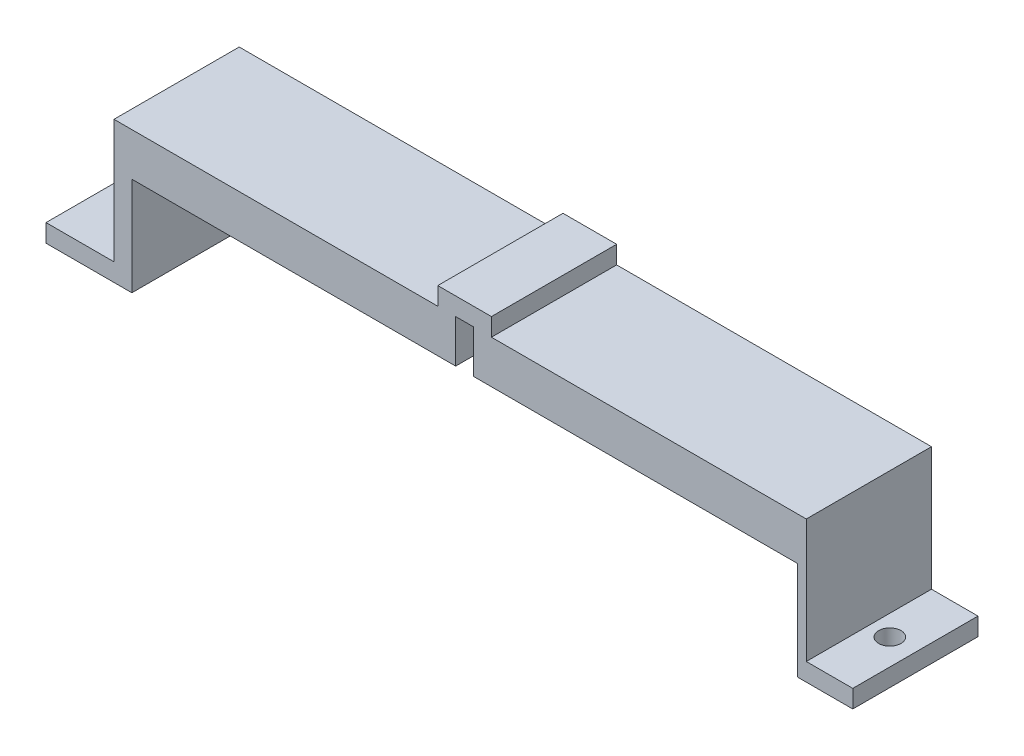
ISO-10303-21;
HEADER;
FILE_DESCRIPTION(('STEP AP214'),'2;1');
FILE_NAME('part.step','',(''),(''),'','','');
FILE_SCHEMA(('AUTOMOTIVE_DESIGN { 1 0 10303 214 1 1 1 1 }'));
ENDSEC;
DATA;
#1=APPLICATION_CONTEXT('core data for automotive mechanical design processes');
#2=APPLICATION_PROTOCOL_DEFINITION('international standard','automotive_design',2000,#1);
#3=PRODUCT_CONTEXT('',#1,'mechanical');
#4=PRODUCT('Part','Part','',(#3));
#5=PRODUCT_RELATED_PRODUCT_CATEGORY('part','',(#4));
#6=PRODUCT_DEFINITION_FORMATION('','',#4);
#7=PRODUCT_DEFINITION_CONTEXT('part definition',#1,'design');
#8=PRODUCT_DEFINITION('design','',#6,#7);
#9=PRODUCT_DEFINITION_SHAPE('','',#8);
#10=(LENGTH_UNIT() NAMED_UNIT(*) SI_UNIT(.MILLI.,.METRE.));
#11=(NAMED_UNIT(*) PLANE_ANGLE_UNIT() SI_UNIT($,.RADIAN.));
#12=(NAMED_UNIT(*) SI_UNIT($,.STERADIAN.) SOLID_ANGLE_UNIT());
#13=UNCERTAINTY_MEASURE_WITH_UNIT(LENGTH_MEASURE(1.E-05),#10,'distance_accuracy_value','');
#14=(GEOMETRIC_REPRESENTATION_CONTEXT(3) GLOBAL_UNCERTAINTY_ASSIGNED_CONTEXT((#13)) GLOBAL_UNIT_ASSIGNED_CONTEXT((#10,
#11,#12)) REPRESENTATION_CONTEXT('',''));
#15=CARTESIAN_POINT('',(0.,0.,0.));
#16=DIRECTION('',(0.,0.,1.));
#17=DIRECTION('',(1.,0.,0.));
#18=AXIS2_PLACEMENT_3D('',#15,#16,#17);
#19=CARTESIAN_POINT('',(2.54000000000001,-8.63600000000001,17.78));
#20=DIRECTION('',(-1.,0.,0.));
#21=DIRECTION('',(0.,-1.,0.));
#22=AXIS2_PLACEMENT_3D('',#19,#20,#21);
#23=PLANE('',#22);
#24=DIRECTION('',(0.,1.,0.));
#25=VECTOR('',#24,1.);
#26=CARTESIAN_POINT('',(2.54000000000001,-8.63600000000001,0.));
#27=LINE('',#26,#25);
#28=CARTESIAN_POINT('',(2.54000000000001,-8.63600000000001,0.));
#29=VERTEX_POINT('',#28);
#30=CARTESIAN_POINT('',(2.54000000000001,-2.54,0.));
#31=VERTEX_POINT('',#30);
#32=EDGE_CURVE('E218',#29,#31,#27,.T.);
#33=ORIENTED_EDGE('',*,*,#32,.T.);
#34=DIRECTION('',(0.,0.,-1.));
#35=VECTOR('',#34,1.);
#36=CARTESIAN_POINT('',(2.54000000000001,-2.54,17.78));
#37=LINE('',#36,#35);
#38=CARTESIAN_POINT('',(2.54000000000001,-2.54,17.78));
#39=VERTEX_POINT('',#38);
#40=EDGE_CURVE('E11',#39,#31,#37,.T.);
#41=ORIENTED_EDGE('',*,*,#40,.F.);
#42=DIRECTION('',(0.,1.,0.));
#43=VECTOR('',#42,1.);
#44=CARTESIAN_POINT('',(2.54000000000001,-8.63600000000001,17.78));
#45=LINE('',#44,#43);
#46=CARTESIAN_POINT('',(2.54000000000001,-8.63600000000001,17.78));
#47=VERTEX_POINT('',#46);
#48=EDGE_CURVE('E276',#47,#39,#45,.T.);
#49=ORIENTED_EDGE('',*,*,#48,.F.);
#50=DIRECTION('',(0.,0.,-1.));
#51=VECTOR('',#50,1.);
#52=CARTESIAN_POINT('',(2.54000000000001,-8.63600000000001,17.78));
#53=LINE('',#52,#51);
#54=EDGE_CURVE('E214',#47,#29,#53,.T.);
#55=ORIENTED_EDGE('',*,*,#54,.T.);
#56=EDGE_LOOP('',(#33,#41,#49,#55));
#57=FACE_BOUND('',#56,.T.);
#58=ADVANCED_FACE('F44',(#57),#23,.F.);
#59=CARTESIAN_POINT('',(2.54000000000001,-2.54,17.78));
#60=DIRECTION('',(0.,1.,0.));
#61=DIRECTION('',(0.,0.,1.));
#62=AXIS2_PLACEMENT_3D('',#59,#60,#61);
#63=PLANE('',#62);
#64=DIRECTION('',(1.,0.,0.));
#65=VECTOR('',#64,1.);
#66=CARTESIAN_POINT('',(2.54000000000001,-2.54,0.));
#67=LINE('',#66,#65);
#68=CARTESIAN_POINT('',(5.08000000000001,-2.54,0.));
#69=VERTEX_POINT('',#68);
#70=EDGE_CURVE('E222',#31,#69,#67,.T.);
#71=ORIENTED_EDGE('',*,*,#70,.T.);
#72=DIRECTION('',(0.,0.,-1.));
#73=VECTOR('',#72,1.);
#74=CARTESIAN_POINT('',(5.08000000000001,-2.54,17.78));
#75=LINE('',#74,#73);
#76=CARTESIAN_POINT('',(5.08000000000001,-2.54,17.78));
#77=VERTEX_POINT('',#76);
#78=EDGE_CURVE('E54',#77,#69,#75,.T.);
#79=ORIENTED_EDGE('',*,*,#78,.F.);
#80=DIRECTION('',(1.,0.,0.));
#81=VECTOR('',#80,1.);
#82=CARTESIAN_POINT('',(2.54000000000001,-2.54,17.78));
#83=LINE('',#82,#81);
#84=EDGE_CURVE('E141',#39,#77,#83,.T.);
#85=ORIENTED_EDGE('',*,*,#84,.F.);
#86=ORIENTED_EDGE('',*,*,#40,.T.);
#87=EDGE_LOOP('',(#71,#79,#85,#86));
#88=FACE_BOUND('',#87,.T.);
#89=ADVANCED_FACE('F427',(#88),#63,.F.);
#90=CARTESIAN_POINT('',(5.08000000000001,-2.54,17.78));
#91=DIRECTION('',(1.,0.,0.));
#92=DIRECTION('',(0.,1.,0.));
#93=AXIS2_PLACEMENT_3D('',#90,#91,#92);
#94=PLANE('',#93);
#95=DIRECTION('',(0.,-1.,0.));
#96=VECTOR('',#95,1.);
#97=CARTESIAN_POINT('',(5.08000000000001,-2.54,0.));
#98=LINE('',#97,#96);
#99=CARTESIAN_POINT('',(5.08000000000001,-8.636,0.));
#100=VERTEX_POINT('',#99);
#101=EDGE_CURVE('E225',#69,#100,#98,.T.);
#102=ORIENTED_EDGE('',*,*,#101,.T.);
#103=DIRECTION('',(0.,0.,-1.));
#104=VECTOR('',#103,1.);
#105=CARTESIAN_POINT('',(5.08000000000001,-8.636,17.78));
#106=LINE('',#105,#104);
#107=CARTESIAN_POINT('',(5.08000000000001,-8.636,17.78));
#108=VERTEX_POINT('',#107);
#109=EDGE_CURVE('E335',#108,#100,#106,.T.);
#110=ORIENTED_EDGE('',*,*,#109,.F.);
#111=DIRECTION('',(0.,-1.,0.));
#112=VECTOR('',#111,1.);
#113=CARTESIAN_POINT('',(5.08000000000001,-2.54,17.78));
#114=LINE('',#113,#112);
#115=EDGE_CURVE('E346',#77,#108,#114,.T.);
#116=ORIENTED_EDGE('',*,*,#115,.F.);
#117=ORIENTED_EDGE('',*,*,#78,.T.);
#118=EDGE_LOOP('',(#102,#110,#116,#117));
#119=FACE_BOUND('',#118,.T.);
#120=ADVANCED_FACE('F344',(#119),#94,.F.);
#121=CARTESIAN_POINT('',(5.08000000000001,-8.636,17.78));
#122=DIRECTION('',(0.,1.,0.));
#123=DIRECTION('',(0.,0.,1.));
#124=AXIS2_PLACEMENT_3D('',#121,#122,#123);
#125=PLANE('',#124);
#126=DIRECTION('',(1.,0.,0.));
#127=VECTOR('',#126,1.);
#128=CARTESIAN_POINT('',(5.08000000000001,-8.636,0.));
#129=LINE('',#128,#127);
#130=CARTESIAN_POINT('',(51.054,-8.636,0.));
#131=VERTEX_POINT('',#130);
#132=EDGE_CURVE('E228',#100,#131,#129,.T.);
#133=ORIENTED_EDGE('',*,*,#132,.T.);
#134=DIRECTION('',(0.,0.,-1.));
#135=VECTOR('',#134,1.);
#136=CARTESIAN_POINT('',(51.054,-8.636,17.78));
#137=LINE('',#136,#135);
#138=CARTESIAN_POINT('',(51.054,-8.636,17.78));
#139=VERTEX_POINT('',#138);
#140=EDGE_CURVE('E331',#139,#131,#137,.T.);
#141=ORIENTED_EDGE('',*,*,#140,.F.);
#142=DIRECTION('',(1.,0.,0.));
#143=VECTOR('',#142,1.);
#144=CARTESIAN_POINT('',(5.08000000000001,-8.636,17.78));
#145=LINE('',#144,#143);
#146=EDGE_CURVE('E365',#108,#139,#145,.T.);
#147=ORIENTED_EDGE('',*,*,#146,.F.);
#148=ORIENTED_EDGE('',*,*,#109,.T.);
#149=EDGE_LOOP('',(#133,#141,#147,#148));
#150=FACE_BOUND('',#149,.T.);
#151=ADVANCED_FACE('F355',(#150),#125,.F.);
#152=CARTESIAN_POINT('',(51.054,-22.606,17.78));
#153=DIRECTION('',(1.,0.,0.));
#154=DIRECTION('',(0.,0.,-1.));
#155=AXIS2_PLACEMENT_3D('',#152,#153,#154);
#156=PLANE('',#155);
#157=DIRECTION('',(0.,-1.,0.));
#158=VECTOR('',#157,1.);
#159=CARTESIAN_POINT('',(51.054,-22.606,0.));
#160=LINE('',#159,#158);
#161=CARTESIAN_POINT('',(51.054,-22.606,0.));
#162=VERTEX_POINT('',#161);
#163=EDGE_CURVE('E231',#131,#162,#160,.T.);
#164=ORIENTED_EDGE('',*,*,#163,.T.);
#165=DIRECTION('',(0.,0.,-1.));
#166=VECTOR('',#165,1.);
#167=CARTESIAN_POINT('',(51.054,-22.606,17.78));
#168=LINE('',#167,#166);
#169=CARTESIAN_POINT('',(51.054,-22.606,17.78));
#170=VERTEX_POINT('',#169);
#171=EDGE_CURVE('E327',#170,#162,#168,.T.);
#172=ORIENTED_EDGE('',*,*,#171,.F.);
#173=DIRECTION('',(0.,-1.,0.));
#174=VECTOR('',#173,1.);
#175=CARTESIAN_POINT('',(51.054,-22.606,17.78));
#176=LINE('',#175,#174);
#177=EDGE_CURVE('E361',#139,#170,#176,.T.);
#178=ORIENTED_EDGE('',*,*,#177,.F.);
#179=ORIENTED_EDGE('',*,*,#140,.T.);
#180=EDGE_LOOP('',(#164,#172,#178,#179));
#181=FACE_BOUND('',#180,.T.);
#182=ADVANCED_FACE('F359',(#181),#156,.F.);
#183=CARTESIAN_POINT('',(51.054,-22.606,17.78));
#184=DIRECTION('',(0.,1.,0.));
#185=DIRECTION('',(0.,0.,1.));
#186=AXIS2_PLACEMENT_3D('',#183,#184,#185);
#187=PLANE('',#186);
#188=CARTESIAN_POINT('',(55.2449999999999,-22.606,8.83993647290593));
#189=DIRECTION('',(0.,-1.,0.));
#190=DIRECTION('',(0.,0.,-1.));
#191=AXIS2_PLACEMENT_3D('',#188,#189,#190);
#192=CIRCLE('',#191,1.5875);
#193=CARTESIAN_POINT('',(55.2449999999999,-22.606,7.25243647290593));
#194=VERTEX_POINT('',#193);
#195=EDGE_CURVE('E496',#194,#194,#192,.T.);
#196=ORIENTED_EDGE('',*,*,#195,.F.);
#197=EDGE_LOOP('',(#196));
#198=FACE_BOUND('',#197,.T.);
#199=DIRECTION('',(1.,0.,0.));
#200=VECTOR('',#199,1.);
#201=CARTESIAN_POINT('',(51.054,-22.606,0.));
#202=LINE('',#201,#200);
#203=CARTESIAN_POINT('',(58.928,-22.606,0.));
#204=VERTEX_POINT('',#203);
#205=EDGE_CURVE('E234',#162,#204,#202,.T.);
#206=ORIENTED_EDGE('',*,*,#205,.T.);
#207=DIRECTION('',(0.,0.,-1.));
#208=VECTOR('',#207,1.);
#209=CARTESIAN_POINT('',(58.928,-22.606,17.78));
#210=LINE('',#209,#208);
#211=CARTESIAN_POINT('',(58.928,-22.606,17.78));
#212=VERTEX_POINT('',#211);
#213=EDGE_CURVE('E323',#212,#204,#210,.T.);
#214=ORIENTED_EDGE('',*,*,#213,.F.);
#215=DIRECTION('',(1.,0.,0.));
#216=VECTOR('',#215,1.);
#217=CARTESIAN_POINT('',(51.054,-22.606,17.78));
#218=LINE('',#217,#216);
#219=EDGE_CURVE('E364',#170,#212,#218,.T.);
#220=ORIENTED_EDGE('',*,*,#219,.F.);
#221=ORIENTED_EDGE('',*,*,#171,.T.);
#222=EDGE_LOOP('',(#206,#214,#220,#221));
#223=FACE_BOUND('',#222,.T.);
#224=ADVANCED_FACE('F440',(#198,#223),#187,.F.);
#225=CARTESIAN_POINT('',(58.928,-22.606,17.78));
#226=DIRECTION('',(-1.,0.,0.));
#227=DIRECTION('',(0.,0.,1.));
#228=AXIS2_PLACEMENT_3D('',#225,#226,#227);
#229=PLANE('',#228);
#230=DIRECTION('',(0.,1.,0.));
#231=VECTOR('',#230,1.);
#232=CARTESIAN_POINT('',(58.928,-22.606,0.));
#233=LINE('',#232,#231);
#234=CARTESIAN_POINT('',(58.928,-20.066,0.));
#235=VERTEX_POINT('',#234);
#236=EDGE_CURVE('E237',#204,#235,#233,.T.);
#237=ORIENTED_EDGE('',*,*,#236,.T.);
#238=DIRECTION('',(0.,0.,-1.));
#239=VECTOR('',#238,1.);
#240=CARTESIAN_POINT('',(58.928,-20.066,17.78));
#241=LINE('',#240,#239);
#242=CARTESIAN_POINT('',(58.928,-20.066,17.78));
#243=VERTEX_POINT('',#242);
#244=EDGE_CURVE('E319',#243,#235,#241,.T.);
#245=ORIENTED_EDGE('',*,*,#244,.F.);
#246=DIRECTION('',(0.,1.,0.));
#247=VECTOR('',#246,1.);
#248=CARTESIAN_POINT('',(58.928,-22.606,17.78));
#249=LINE('',#248,#247);
#250=EDGE_CURVE('E369',#212,#243,#249,.T.);
#251=ORIENTED_EDGE('',*,*,#250,.F.);
#252=ORIENTED_EDGE('',*,*,#213,.T.);
#253=EDGE_LOOP('',(#237,#245,#251,#252));
#254=FACE_BOUND('',#253,.T.);
#255=ADVANCED_FACE('F443',(#254),#229,.F.);
#256=CARTESIAN_POINT('',(58.928,-20.066,17.78));
#257=DIRECTION('',(0.,-1.,0.));
#258=DIRECTION('',(0.,0.,-1.));
#259=AXIS2_PLACEMENT_3D('',#256,#257,#258);
#260=PLANE('',#259);
#261=CARTESIAN_POINT('',(55.2449999999999,-20.066,8.83993647290593));
#262=DIRECTION('',(0.,-1.,0.));
#263=DIRECTION('',(0.,0.,-1.));
#264=AXIS2_PLACEMENT_3D('',#261,#262,#263);
#265=CIRCLE('',#264,1.5875);
#266=CARTESIAN_POINT('',(55.2449999999999,-20.066,7.25243647290593));
#267=VERTEX_POINT('',#266);
#268=EDGE_CURVE('E47',#267,#267,#265,.T.);
#269=ORIENTED_EDGE('',*,*,#268,.T.);
#270=EDGE_LOOP('',(#269));
#271=FACE_BOUND('',#270,.T.);
#272=DIRECTION('',(-1.,0.,0.));
#273=VECTOR('',#272,1.);
#274=CARTESIAN_POINT('',(58.928,-20.066,0.));
#275=LINE('',#274,#273);
#276=CARTESIAN_POINT('',(52.324,-20.066,0.));
#277=VERTEX_POINT('',#276);
#278=EDGE_CURVE('E240',#235,#277,#275,.T.);
#279=ORIENTED_EDGE('',*,*,#278,.T.);
#280=DIRECTION('',(0.,0.,-1.));
#281=VECTOR('',#280,1.);
#282=CARTESIAN_POINT('',(52.324,-20.066,17.78));
#283=LINE('',#282,#281);
#284=CARTESIAN_POINT('',(52.324,-20.066,17.78));
#285=VERTEX_POINT('',#284);
#286=EDGE_CURVE('E315',#285,#277,#283,.T.);
#287=ORIENTED_EDGE('',*,*,#286,.F.);
#288=DIRECTION('',(-1.,0.,0.));
#289=VECTOR('',#288,1.);
#290=CARTESIAN_POINT('',(58.928,-20.066,17.78));
#291=LINE('',#290,#289);
#292=EDGE_CURVE('E376',#243,#285,#291,.T.);
#293=ORIENTED_EDGE('',*,*,#292,.F.);
#294=ORIENTED_EDGE('',*,*,#244,.T.);
#295=EDGE_LOOP('',(#279,#287,#293,#294));
#296=FACE_BOUND('',#295,.T.);
#297=ADVANCED_FACE('F447',(#271,#296),#260,.F.);
#298=CARTESIAN_POINT('',(52.324,-20.066,17.78));
#299=DIRECTION('',(-1.,0.,0.));
#300=DIRECTION('',(0.,0.,1.));
#301=AXIS2_PLACEMENT_3D('',#298,#299,#300);
#302=PLANE('',#301);
#303=DIRECTION('',(0.,1.,0.));
#304=VECTOR('',#303,1.);
#305=CARTESIAN_POINT('',(52.324,-20.066,0.));
#306=LINE('',#305,#304);
#307=CARTESIAN_POINT('',(52.324,-2.54,0.));
#308=VERTEX_POINT('',#307);
#309=EDGE_CURVE('E243',#277,#308,#306,.T.);
#310=ORIENTED_EDGE('',*,*,#309,.T.);
#311=DIRECTION('',(0.,0.,-1.));
#312=VECTOR('',#311,1.);
#313=CARTESIAN_POINT('',(52.324,-2.54,17.78));
#314=LINE('',#313,#312);
#315=CARTESIAN_POINT('',(52.324,-2.54,17.78));
#316=VERTEX_POINT('',#315);
#317=EDGE_CURVE('E311',#316,#308,#314,.T.);
#318=ORIENTED_EDGE('',*,*,#317,.F.);
#319=DIRECTION('',(0.,1.,0.));
#320=VECTOR('',#319,1.);
#321=CARTESIAN_POINT('',(52.324,-20.066,17.78));
#322=LINE('',#321,#320);
#323=EDGE_CURVE('E379',#285,#316,#322,.T.);
#324=ORIENTED_EDGE('',*,*,#323,.F.);
#325=ORIENTED_EDGE('',*,*,#286,.T.);
#326=EDGE_LOOP('',(#310,#318,#324,#325));
#327=FACE_BOUND('',#326,.T.);
#328=ADVANCED_FACE('F451',(#327),#302,.F.);
#329=CARTESIAN_POINT('',(7.62000000000001,-2.54,17.78));
#330=DIRECTION('',(0.,-1.,0.));
#331=DIRECTION('',(1.,0.,0.));
#332=AXIS2_PLACEMENT_3D('',#329,#330,#331);
#333=PLANE('',#332);
#334=DIRECTION('',(-1.,0.,0.));
#335=VECTOR('',#334,1.);
#336=CARTESIAN_POINT('',(7.62000000000001,-2.54,0.));
#337=LINE('',#336,#335);
#338=CARTESIAN_POINT('',(7.62000000000001,-2.54,0.));
#339=VERTEX_POINT('',#338);
#340=EDGE_CURVE('E246',#308,#339,#337,.T.);
#341=ORIENTED_EDGE('',*,*,#340,.T.);
#342=DIRECTION('',(0.,0.,-1.));
#343=VECTOR('',#342,1.);
#344=CARTESIAN_POINT('',(7.62000000000001,-2.54,17.78));
#345=LINE('',#344,#343);
#346=CARTESIAN_POINT('',(7.62000000000001,-2.54,17.78));
#347=VERTEX_POINT('',#346);
#348=EDGE_CURVE('E307',#347,#339,#345,.T.);
#349=ORIENTED_EDGE('',*,*,#348,.F.);
#350=DIRECTION('',(-1.,0.,0.));
#351=VECTOR('',#350,1.);
#352=CARTESIAN_POINT('',(7.62000000000001,-2.54,17.78));
#353=LINE('',#352,#351);
#354=EDGE_CURVE('E382',#316,#347,#353,.T.);
#355=ORIENTED_EDGE('',*,*,#354,.F.);
#356=ORIENTED_EDGE('',*,*,#317,.T.);
#357=EDGE_LOOP('',(#341,#349,#355,#356));
#358=FACE_BOUND('',#357,.T.);
#359=ADVANCED_FACE('F455',(#358),#333,.F.);
#360=CARTESIAN_POINT('',(7.62000000000001,-2.54,17.78));
#361=DIRECTION('',(-1.,0.,0.));
#362=DIRECTION('',(0.,0.,1.));
#363=AXIS2_PLACEMENT_3D('',#360,#361,#362);
#364=PLANE('',#363);
#365=DIRECTION('',(0.,1.,0.));
#366=VECTOR('',#365,1.);
#367=CARTESIAN_POINT('',(7.62000000000001,-2.54,0.));
#368=LINE('',#367,#366);
#369=CARTESIAN_POINT('',(7.62000000000001,0.,0.));
#370=VERTEX_POINT('',#369);
#371=EDGE_CURVE('E249',#339,#370,#368,.T.);
#372=ORIENTED_EDGE('',*,*,#371,.T.);
#373=DIRECTION('',(0.,0.,-1.));
#374=VECTOR('',#373,1.);
#375=CARTESIAN_POINT('',(7.62000000000001,0.,17.78));
#376=LINE('',#375,#374);
#377=CARTESIAN_POINT('',(7.62000000000001,0.,17.78));
#378=VERTEX_POINT('',#377);
#379=EDGE_CURVE('E303',#378,#370,#376,.T.);
#380=ORIENTED_EDGE('',*,*,#379,.F.);
#381=DIRECTION('',(0.,1.,0.));
#382=VECTOR('',#381,1.);
#383=CARTESIAN_POINT('',(7.62000000000001,-2.54,17.78));
#384=LINE('',#383,#382);
#385=EDGE_CURVE('E385',#347,#378,#384,.T.);
#386=ORIENTED_EDGE('',*,*,#385,.F.);
#387=ORIENTED_EDGE('',*,*,#348,.T.);
#388=EDGE_LOOP('',(#372,#380,#386,#387));
#389=FACE_BOUND('',#388,.T.);
#390=ADVANCED_FACE('F459',(#389),#364,.F.);
#391=CARTESIAN_POINT('',(7.62000000000001,0.,17.78));
#392=DIRECTION('',(0.,-1.,0.));
#393=DIRECTION('',(0.,0.,-1.));
#394=AXIS2_PLACEMENT_3D('',#391,#392,#393);
#395=PLANE('',#394);
#396=DIRECTION('',(-1.,0.,0.));
#397=VECTOR('',#396,1.);
#398=CARTESIAN_POINT('',(7.62000000000001,0.,0.));
#399=LINE('',#398,#397);
#400=CARTESIAN_POINT('',(0.,0.,0.));
#401=VERTEX_POINT('',#400);
#402=EDGE_CURVE('E252',#370,#401,#399,.T.);
#403=ORIENTED_EDGE('',*,*,#402,.T.);
#404=DIRECTION('',(0.,0.,-1.));
#405=VECTOR('',#404,1.);
#406=CARTESIAN_POINT('',(0.,0.,17.78));
#407=LINE('',#406,#405);
#408=CARTESIAN_POINT('',(0.,0.,17.78));
#409=VERTEX_POINT('',#408);
#410=EDGE_CURVE('E299',#409,#401,#407,.T.);
#411=ORIENTED_EDGE('',*,*,#410,.F.);
#412=DIRECTION('',(-1.,0.,0.));
#413=VECTOR('',#412,1.);
#414=CARTESIAN_POINT('',(7.62000000000001,0.,17.78));
#415=LINE('',#414,#413);
#416=EDGE_CURVE('E388',#378,#409,#415,.T.);
#417=ORIENTED_EDGE('',*,*,#416,.F.);
#418=ORIENTED_EDGE('',*,*,#379,.T.);
#419=EDGE_LOOP('',(#403,#411,#417,#418));
#420=FACE_BOUND('',#419,.T.);
#421=ADVANCED_FACE('F463',(#420),#395,.F.);
#422=CARTESIAN_POINT('',(0.,0.,17.78));
#423=DIRECTION('',(1.,0.,0.));
#424=DIRECTION('',(0.,0.,-1.));
#425=AXIS2_PLACEMENT_3D('',#422,#423,#424);
#426=PLANE('',#425);
#427=DIRECTION('',(0.,-1.,0.));
#428=VECTOR('',#427,1.);
#429=CARTESIAN_POINT('',(0.,0.,0.));
#430=LINE('',#429,#428);
#431=CARTESIAN_POINT('',(0.,-2.54000000000001,0.));
#432=VERTEX_POINT('',#431);
#433=EDGE_CURVE('E255',#401,#432,#430,.T.);
#434=ORIENTED_EDGE('',*,*,#433,.T.);
#435=DIRECTION('',(0.,0.,-1.));
#436=VECTOR('',#435,1.);
#437=CARTESIAN_POINT('',(0.,-2.54000000000001,17.78));
#438=LINE('',#437,#436);
#439=CARTESIAN_POINT('',(0.,-2.54000000000001,17.78));
#440=VERTEX_POINT('',#439);
#441=EDGE_CURVE('E295',#440,#432,#438,.T.);
#442=ORIENTED_EDGE('',*,*,#441,.F.);
#443=DIRECTION('',(0.,-1.,0.));
#444=VECTOR('',#443,1.);
#445=CARTESIAN_POINT('',(0.,0.,17.78));
#446=LINE('',#445,#444);
#447=EDGE_CURVE('E391',#409,#440,#446,.T.);
#448=ORIENTED_EDGE('',*,*,#447,.F.);
#449=ORIENTED_EDGE('',*,*,#410,.T.);
#450=EDGE_LOOP('',(#434,#442,#448,#449));
#451=FACE_BOUND('',#450,.T.);
#452=ADVANCED_FACE('F467',(#451),#426,.F.);
#453=CARTESIAN_POINT('',(-45.974,-2.54000000000001,17.78));
#454=DIRECTION('',(0.,-1.,0.));
#455=DIRECTION('',(0.,0.,-1.));
#456=AXIS2_PLACEMENT_3D('',#453,#454,#455);
#457=PLANE('',#456);
#458=DIRECTION('',(-1.,0.,0.));
#459=VECTOR('',#458,1.);
#460=CARTESIAN_POINT('',(-45.974,-2.54000000000001,0.));
#461=LINE('',#460,#459);
#462=CARTESIAN_POINT('',(-45.974,-2.54000000000001,0.));
#463=VERTEX_POINT('',#462);
#464=EDGE_CURVE('E258',#432,#463,#461,.T.);
#465=ORIENTED_EDGE('',*,*,#464,.T.);
#466=DIRECTION('',(0.,0.,-1.));
#467=VECTOR('',#466,1.);
#468=CARTESIAN_POINT('',(-45.974,-2.54000000000001,17.78));
#469=LINE('',#468,#467);
#470=CARTESIAN_POINT('',(-45.974,-2.54000000000001,17.78));
#471=VERTEX_POINT('',#470);
#472=EDGE_CURVE('E291',#471,#463,#469,.T.);
#473=ORIENTED_EDGE('',*,*,#472,.F.);
#474=DIRECTION('',(-1.,0.,0.));
#475=VECTOR('',#474,1.);
#476=CARTESIAN_POINT('',(-45.974,-2.54000000000001,17.78));
#477=LINE('',#476,#475);
#478=EDGE_CURVE('E394',#440,#471,#477,.T.);
#479=ORIENTED_EDGE('',*,*,#478,.F.);
#480=ORIENTED_EDGE('',*,*,#441,.T.);
#481=EDGE_LOOP('',(#465,#473,#479,#480));
#482=FACE_BOUND('',#481,.T.);
#483=ADVANCED_FACE('F471',(#482),#457,.F.);
#484=CARTESIAN_POINT('',(-45.974,-20.066,17.78));
#485=DIRECTION('',(1.,0.,0.));
#486=DIRECTION('',(0.,0.,-1.));
#487=AXIS2_PLACEMENT_3D('',#484,#485,#486);
#488=PLANE('',#487);
#489=DIRECTION('',(0.,-1.,0.));
#490=VECTOR('',#489,1.);
#491=CARTESIAN_POINT('',(-45.974,-20.066,0.));
#492=LINE('',#491,#490);
#493=CARTESIAN_POINT('',(-45.974,-20.066,0.));
#494=VERTEX_POINT('',#493);
#495=EDGE_CURVE('E261',#463,#494,#492,.T.);
#496=ORIENTED_EDGE('',*,*,#495,.T.);
#497=DIRECTION('',(0.,0.,-1.));
#498=VECTOR('',#497,1.);
#499=CARTESIAN_POINT('',(-45.974,-20.066,17.78));
#500=LINE('',#499,#498);
#501=CARTESIAN_POINT('',(-45.974,-20.066,17.78));
#502=VERTEX_POINT('',#501);
#503=EDGE_CURVE('E287',#502,#494,#500,.T.);
#504=ORIENTED_EDGE('',*,*,#503,.F.);
#505=DIRECTION('',(0.,-1.,0.));
#506=VECTOR('',#505,1.);
#507=CARTESIAN_POINT('',(-45.974,-20.066,17.78));
#508=LINE('',#507,#506);
#509=EDGE_CURVE('E397',#471,#502,#508,.T.);
#510=ORIENTED_EDGE('',*,*,#509,.F.);
#511=ORIENTED_EDGE('',*,*,#472,.T.);
#512=EDGE_LOOP('',(#496,#504,#510,#511));
#513=FACE_BOUND('',#512,.T.);
#514=ADVANCED_FACE('F475',(#513),#488,.F.);
#515=CARTESIAN_POINT('',(-55.626,-20.066,17.78));
#516=DIRECTION('',(0.,-1.,0.));
#517=DIRECTION('',(0.,0.,-1.));
#518=AXIS2_PLACEMENT_3D('',#515,#516,#517);
#519=PLANE('',#518);
#520=CARTESIAN_POINT('',(-51.9430000000001,-20.066,8.83993647290593));
#521=DIRECTION('',(0.,-1.,0.));
#522=DIRECTION('',(0.,0.,-1.));
#523=AXIS2_PLACEMENT_3D('',#520,#521,#522);
#524=CIRCLE('',#523,1.58750000000001);
#525=CARTESIAN_POINT('',(-51.9430000000001,-20.066,7.25243647290592));
#526=VERTEX_POINT('',#525);
#527=EDGE_CURVE('E495',#526,#526,#524,.T.);
#528=ORIENTED_EDGE('',*,*,#527,.T.);
#529=EDGE_LOOP('',(#528));
#530=FACE_BOUND('',#529,.T.);
#531=DIRECTION('',(-1.,0.,0.));
#532=VECTOR('',#531,1.);
#533=CARTESIAN_POINT('',(-55.626,-20.066,0.));
#534=LINE('',#533,#532);
#535=CARTESIAN_POINT('',(-55.626,-20.066,0.));
#536=VERTEX_POINT('',#535);
#537=EDGE_CURVE('E264',#494,#536,#534,.T.);
#538=ORIENTED_EDGE('',*,*,#537,.T.);
#539=DIRECTION('',(0.,0.,-1.));
#540=VECTOR('',#539,1.);
#541=CARTESIAN_POINT('',(-55.626,-20.066,17.78));
#542=LINE('',#541,#540);
#543=CARTESIAN_POINT('',(-55.626,-20.066,17.78));
#544=VERTEX_POINT('',#543);
#545=EDGE_CURVE('E283',#544,#536,#542,.T.);
#546=ORIENTED_EDGE('',*,*,#545,.F.);
#547=DIRECTION('',(-1.,0.,0.));
#548=VECTOR('',#547,1.);
#549=CARTESIAN_POINT('',(-55.626,-20.066,17.78));
#550=LINE('',#549,#548);
#551=EDGE_CURVE('E400',#502,#544,#550,.T.);
#552=ORIENTED_EDGE('',*,*,#551,.F.);
#553=ORIENTED_EDGE('',*,*,#503,.T.);
#554=EDGE_LOOP('',(#538,#546,#552,#553));
#555=FACE_BOUND('',#554,.T.);
#556=ADVANCED_FACE('F408',(#530,#555),#519,.F.);
#557=CARTESIAN_POINT('',(-55.626,-20.066,17.78));
#558=DIRECTION('',(1.,0.,0.));
#559=DIRECTION('',(0.,0.,-1.));
#560=AXIS2_PLACEMENT_3D('',#557,#558,#559);
#561=PLANE('',#560);
#562=DIRECTION('',(0.,-1.,0.));
#563=VECTOR('',#562,1.);
#564=CARTESIAN_POINT('',(-55.626,-20.066,0.));
#565=LINE('',#564,#563);
#566=CARTESIAN_POINT('',(-55.626,-22.606,0.));
#567=VERTEX_POINT('',#566);
#568=EDGE_CURVE('E267',#536,#567,#565,.T.);
#569=ORIENTED_EDGE('',*,*,#568,.T.);
#570=DIRECTION('',(0.,0.,-1.));
#571=VECTOR('',#570,1.);
#572=CARTESIAN_POINT('',(-55.626,-22.606,17.78));
#573=LINE('',#572,#571);
#574=CARTESIAN_POINT('',(-55.626,-22.606,17.78));
#575=VERTEX_POINT('',#574);
#576=EDGE_CURVE('E207',#575,#567,#573,.T.);
#577=ORIENTED_EDGE('',*,*,#576,.F.);
#578=DIRECTION('',(0.,-1.,0.));
#579=VECTOR('',#578,1.);
#580=CARTESIAN_POINT('',(-55.626,-20.066,17.78));
#581=LINE('',#580,#579);
#582=EDGE_CURVE('E196',#544,#575,#581,.T.);
#583=ORIENTED_EDGE('',*,*,#582,.F.);
#584=ORIENTED_EDGE('',*,*,#545,.T.);
#585=EDGE_LOOP('',(#569,#577,#583,#584));
#586=FACE_BOUND('',#585,.T.);
#587=ADVANCED_FACE('F412',(#586),#561,.F.);
#588=CARTESIAN_POINT('',(-55.626,-22.606,17.78));
#589=DIRECTION('',(0.,1.,0.));
#590=DIRECTION('',(0.,0.,1.));
#591=AXIS2_PLACEMENT_3D('',#588,#589,#590);
#592=PLANE('',#591);
#593=CARTESIAN_POINT('',(-51.9430000000001,-22.606,8.83993647290593));
#594=DIRECTION('',(0.,-1.,0.));
#595=DIRECTION('',(0.,0.,-1.));
#596=AXIS2_PLACEMENT_3D('',#593,#594,#595);
#597=CIRCLE('',#596,1.58750000000001);
#598=CARTESIAN_POINT('',(-51.9430000000001,-22.606,7.25243647290592));
#599=VERTEX_POINT('',#598);
#600=EDGE_CURVE('E492',#599,#599,#597,.T.);
#601=ORIENTED_EDGE('',*,*,#600,.F.);
#602=EDGE_LOOP('',(#601));
#603=FACE_BOUND('',#602,.T.);
#604=DIRECTION('',(1.,0.,0.));
#605=VECTOR('',#604,1.);
#606=CARTESIAN_POINT('',(-55.626,-22.606,0.));
#607=LINE('',#606,#605);
#608=CARTESIAN_POINT('',(-43.434,-22.606,0.));
#609=VERTEX_POINT('',#608);
#610=EDGE_CURVE('E205',#567,#609,#607,.T.);
#611=ORIENTED_EDGE('',*,*,#610,.T.);
#612=DIRECTION('',(0.,0.,-1.));
#613=VECTOR('',#612,1.);
#614=CARTESIAN_POINT('',(-43.434,-22.606,17.78));
#615=LINE('',#614,#613);
#616=CARTESIAN_POINT('',(-43.434,-22.606,17.78));
#617=VERTEX_POINT('',#616);
#618=EDGE_CURVE('E202',#617,#609,#615,.T.);
#619=ORIENTED_EDGE('',*,*,#618,.F.);
#620=DIRECTION('',(1.,0.,0.));
#621=VECTOR('',#620,1.);
#622=CARTESIAN_POINT('',(-55.626,-22.606,17.78));
#623=LINE('',#622,#621);
#624=EDGE_CURVE('E190',#575,#617,#623,.T.);
#625=ORIENTED_EDGE('',*,*,#624,.F.);
#626=ORIENTED_EDGE('',*,*,#576,.T.);
#627=EDGE_LOOP('',(#611,#619,#625,#626));
#628=FACE_BOUND('',#627,.T.);
#629=ADVANCED_FACE('F203',(#603,#628),#592,.F.);
#630=CARTESIAN_POINT('',(-43.434,-8.63600000000001,17.78));
#631=DIRECTION('',(-1.,0.,0.));
#632=DIRECTION('',(0.,0.,1.));
#633=AXIS2_PLACEMENT_3D('',#630,#631,#632);
#634=PLANE('',#633);
#635=DIRECTION('',(0.,1.,0.));
#636=VECTOR('',#635,1.);
#637=CARTESIAN_POINT('',(-43.434,-8.63600000000001,0.));
#638=LINE('',#637,#636);
#639=CARTESIAN_POINT('',(-43.434,-8.63600000000001,0.));
#640=VERTEX_POINT('',#639);
#641=EDGE_CURVE('E127',#609,#640,#638,.T.);
#642=ORIENTED_EDGE('',*,*,#641,.T.);
#643=DIRECTION('',(0.,0.,-1.));
#644=VECTOR('',#643,1.);
#645=CARTESIAN_POINT('',(-43.434,-8.63600000000001,17.78));
#646=LINE('',#645,#644);
#647=CARTESIAN_POINT('',(-43.434,-8.63600000000001,17.78));
#648=VERTEX_POINT('',#647);
#649=EDGE_CURVE('E208',#648,#640,#646,.T.);
#650=ORIENTED_EDGE('',*,*,#649,.F.);
#651=DIRECTION('',(0.,1.,0.));
#652=VECTOR('',#651,1.);
#653=CARTESIAN_POINT('',(-43.434,-8.63600000000001,17.78));
#654=LINE('',#653,#652);
#655=EDGE_CURVE('E194',#617,#648,#654,.T.);
#656=ORIENTED_EDGE('',*,*,#655,.F.);
#657=ORIENTED_EDGE('',*,*,#618,.T.);
#658=EDGE_LOOP('',(#642,#650,#656,#657));
#659=FACE_BOUND('',#658,.T.);
#660=ADVANCED_FACE('F210',(#659),#634,.F.);
#661=CARTESIAN_POINT('',(-43.434,-8.63600000000001,17.78));
#662=DIRECTION('',(0.,1.,0.));
#663=DIRECTION('',(0.,0.,1.));
#664=AXIS2_PLACEMENT_3D('',#661,#662,#663);
#665=PLANE('',#664);
#666=DIRECTION('',(1.,0.,0.));
#667=VECTOR('',#666,1.);
#668=CARTESIAN_POINT('',(-43.434,-8.63600000000001,0.));
#669=LINE('',#668,#667);
#670=EDGE_CURVE('E133',#640,#29,#669,.T.);
#671=ORIENTED_EDGE('',*,*,#670,.T.);
#672=ORIENTED_EDGE('',*,*,#54,.F.);
#673=DIRECTION('',(1.,0.,0.));
#674=VECTOR('',#673,1.);
#675=CARTESIAN_POINT('',(-43.434,-8.63600000000001,17.78));
#676=LINE('',#675,#674);
#677=EDGE_CURVE('E62',#648,#47,#676,.T.);
#678=ORIENTED_EDGE('',*,*,#677,.F.);
#679=ORIENTED_EDGE('',*,*,#649,.T.);
#680=EDGE_LOOP('',(#671,#672,#678,#679));
#681=FACE_BOUND('',#680,.T.);
#682=ADVANCED_FACE('F416',(#681),#665,.F.);
#683=CARTESIAN_POINT('',(0.,0.,17.78));
#684=DIRECTION('',(0.,0.,-1.));
#685=DIRECTION('',(-1.,0.,0.));
#686=AXIS2_PLACEMENT_3D('',#683,#684,#685);
#687=PLANE('',#686);
#688=ORIENTED_EDGE('',*,*,#48,.T.);
#689=ORIENTED_EDGE('',*,*,#84,.T.);
#690=ORIENTED_EDGE('',*,*,#115,.T.);
#691=ORIENTED_EDGE('',*,*,#146,.T.);
#692=ORIENTED_EDGE('',*,*,#177,.T.);
#693=ORIENTED_EDGE('',*,*,#219,.T.);
#694=ORIENTED_EDGE('',*,*,#250,.T.);
#695=ORIENTED_EDGE('',*,*,#292,.T.);
#696=ORIENTED_EDGE('',*,*,#323,.T.);
#697=ORIENTED_EDGE('',*,*,#354,.T.);
#698=ORIENTED_EDGE('',*,*,#385,.T.);
#699=ORIENTED_EDGE('',*,*,#416,.T.);
#700=ORIENTED_EDGE('',*,*,#447,.T.);
#701=ORIENTED_EDGE('',*,*,#478,.T.);
#702=ORIENTED_EDGE('',*,*,#509,.T.);
#703=ORIENTED_EDGE('',*,*,#551,.T.);
#704=ORIENTED_EDGE('',*,*,#582,.T.);
#705=ORIENTED_EDGE('',*,*,#624,.T.);
#706=ORIENTED_EDGE('',*,*,#655,.T.);
#707=ORIENTED_EDGE('',*,*,#677,.T.);
#708=EDGE_LOOP('',(#688,#689,#690,#691,#692,#693,#694,#695,#696,#697,#698,#699,#700,#701,#702,
#703,#704,#705,#706,#707));
#709=FACE_BOUND('',#708,.T.);
#710=ADVANCED_FACE('F192',(#709),#687,.F.);
#711=CARTESIAN_POINT('',(0.,0.,0.));
#712=DIRECTION('',(0.,0.,-1.));
#713=DIRECTION('',(-1.,0.,0.));
#714=AXIS2_PLACEMENT_3D('',#711,#712,#713);
#715=PLANE('',#714);
#716=ORIENTED_EDGE('',*,*,#32,.F.);
#717=ORIENTED_EDGE('',*,*,#670,.F.);
#718=ORIENTED_EDGE('',*,*,#641,.F.);
#719=ORIENTED_EDGE('',*,*,#610,.F.);
#720=ORIENTED_EDGE('',*,*,#568,.F.);
#721=ORIENTED_EDGE('',*,*,#537,.F.);
#722=ORIENTED_EDGE('',*,*,#495,.F.);
#723=ORIENTED_EDGE('',*,*,#464,.F.);
#724=ORIENTED_EDGE('',*,*,#433,.F.);
#725=ORIENTED_EDGE('',*,*,#402,.F.);
#726=ORIENTED_EDGE('',*,*,#371,.F.);
#727=ORIENTED_EDGE('',*,*,#340,.F.);
#728=ORIENTED_EDGE('',*,*,#309,.F.);
#729=ORIENTED_EDGE('',*,*,#278,.F.);
#730=ORIENTED_EDGE('',*,*,#236,.F.);
#731=ORIENTED_EDGE('',*,*,#205,.F.);
#732=ORIENTED_EDGE('',*,*,#163,.F.);
#733=ORIENTED_EDGE('',*,*,#132,.F.);
#734=ORIENTED_EDGE('',*,*,#101,.F.);
#735=ORIENTED_EDGE('',*,*,#70,.F.);
#736=EDGE_LOOP('',(#716,#717,#718,#719,#720,#721,#722,#723,#724,#725,#726,#727,#728,#729,#730,
#731,#732,#733,#734,#735));
#737=FACE_BOUND('',#736,.T.);
#738=ADVANCED_FACE('F350',(#737),#715,.T.);
#739=CARTESIAN_POINT('',(-51.9430000000001,0.,8.83993647290593));
#740=DIRECTION('',(0.,-1.,0.));
#741=DIRECTION('',(0.,0.,-1.));
#742=AXIS2_PLACEMENT_3D('',#739,#740,#741);
#743=CYLINDRICAL_SURFACE('',#742,1.58750000000001);
#744=ORIENTED_EDGE('',*,*,#600,.T.);
#745=EDGE_LOOP('',(#744));
#746=FACE_BOUND('',#745,.T.);
#747=ORIENTED_EDGE('',*,*,#527,.F.);
#748=EDGE_LOOP('',(#747));
#749=FACE_BOUND('',#748,.T.);
#750=ADVANCED_FACE('F516',(#746,#749),#743,.F.);
#751=CARTESIAN_POINT('',(55.2449999999999,0.,8.83993647290593));
#752=DIRECTION('',(0.,-1.,0.));
#753=DIRECTION('',(0.,0.,-1.));
#754=AXIS2_PLACEMENT_3D('',#751,#752,#753);
#755=CYLINDRICAL_SURFACE('',#754,1.5875);
#756=ORIENTED_EDGE('',*,*,#195,.T.);
#757=EDGE_LOOP('',(#756));
#758=FACE_BOUND('',#757,.T.);
#759=ORIENTED_EDGE('',*,*,#268,.F.);
#760=EDGE_LOOP('',(#759));
#761=FACE_BOUND('',#760,.T.);
#762=ADVANCED_FACE('F514',(#758,#761),#755,.F.);
#763=CLOSED_SHELL('',(#58,#89,#120,#151,#182,#224,#255,#297,#328,#359,#390,#421,#452,#483,#514,
#556,#587,#629,#660,#682,#710,#738,#750,#762));
#764=MANIFOLD_SOLID_BREP('B2',#763);
#765=ADVANCED_BREP_SHAPE_REPRESENTATION('',(#18,#764),#14);
#766=SHAPE_DEFINITION_REPRESENTATION(#9,#765);
ENDSEC;
END-ISO-10303-21;
